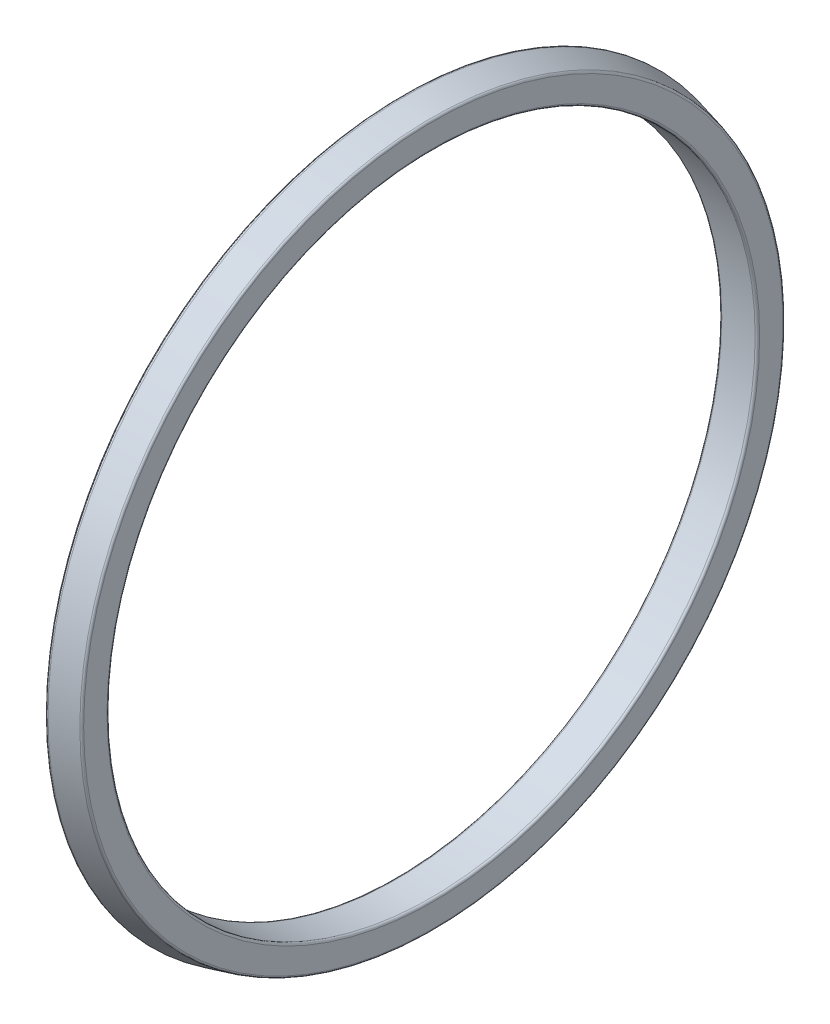
ISO-10303-21;
HEADER;
FILE_DESCRIPTION(('STEP AP214'),'2;1');
FILE_NAME('part.step','',(''),(''),'','','');
FILE_SCHEMA(('AUTOMOTIVE_DESIGN { 1 0 10303 214 1 1 1 1 }'));
ENDSEC;
DATA;
#1=APPLICATION_CONTEXT('core data for automotive mechanical design processes');
#2=APPLICATION_PROTOCOL_DEFINITION('international standard','automotive_design',2000,#1);
#3=PRODUCT_CONTEXT('',#1,'mechanical');
#4=PRODUCT('Part','Part','',(#3));
#5=PRODUCT_RELATED_PRODUCT_CATEGORY('part','',(#4));
#6=PRODUCT_DEFINITION_FORMATION('','',#4);
#7=PRODUCT_DEFINITION_CONTEXT('part definition',#1,'design');
#8=PRODUCT_DEFINITION('design','',#6,#7);
#9=PRODUCT_DEFINITION_SHAPE('','',#8);
#10=(LENGTH_UNIT() NAMED_UNIT(*) SI_UNIT(.MILLI.,.METRE.));
#11=(NAMED_UNIT(*) PLANE_ANGLE_UNIT() SI_UNIT($,.RADIAN.));
#12=(NAMED_UNIT(*) SI_UNIT($,.STERADIAN.) SOLID_ANGLE_UNIT());
#13=UNCERTAINTY_MEASURE_WITH_UNIT(LENGTH_MEASURE(1.E-05),#10,'distance_accuracy_value','');
#14=(GEOMETRIC_REPRESENTATION_CONTEXT(3) GLOBAL_UNCERTAINTY_ASSIGNED_CONTEXT((#13)) GLOBAL_UNIT_ASSIGNED_CONTEXT((#10,
#11,#12)) REPRESENTATION_CONTEXT('',''));
#15=CARTESIAN_POINT('',(0.,0.,0.));
#16=DIRECTION('',(0.,0.,1.));
#17=DIRECTION('',(1.,0.,0.));
#18=AXIS2_PLACEMENT_3D('',#15,#16,#17);
#19=CARTESIAN_POINT('',(2.03338319299465,0.,0.));
#20=DIRECTION('',(-1.,0.,0.));
#21=DIRECTION('',(0.,0.,1.));
#22=AXIS2_PLACEMENT_3D('',#19,#20,#21);
#23=TOROIDAL_SURFACE('',#22,14.5238319449305,0.0999999999999996);
#24=CARTESIAN_POINT('',(2.13338319299465,0.,0.));
#25=DIRECTION('',(-1.,0.,0.));
#26=DIRECTION('',(0.,0.,1.));
#27=AXIS2_PLACEMENT_3D('',#24,#25,#26);
#28=CIRCLE('',#27,14.5238319449305);
#29=CARTESIAN_POINT('',(2.13338319299465,0.,14.5238319449305));
#30=VERTEX_POINT('',#29);
#31=EDGE_CURVE('E81',#30,#30,#28,.T.);
#32=ORIENTED_EDGE('',*,*,#31,.F.);
#33=EDGE_LOOP('',(#32));
#34=FACE_BOUND('',#33,.T.);
#35=CARTESIAN_POINT('',(2.03338319299465,0.,0.));
#36=DIRECTION('',(-1.,0.,0.));
#37=DIRECTION('',(0.,0.,1.));
#38=AXIS2_PLACEMENT_3D('',#35,#36,#37);
#39=CIRCLE('',#38,14.4238319449305);
#40=CARTESIAN_POINT('',(2.03338319299465,0.,14.4238319449305));
#41=VERTEX_POINT('',#40);
#42=EDGE_CURVE('E10',#41,#41,#39,.T.);
#43=ORIENTED_EDGE('',*,*,#42,.T.);
#44=EDGE_LOOP('',(#43));
#45=FACE_BOUND('',#44,.T.);
#46=ADVANCED_FACE('F35',(#34,#45),#23,.T.);
#47=CARTESIAN_POINT('',(0.,0.,0.));
#48=DIRECTION('',(-1.,0.,0.));
#49=DIRECTION('',(0.,0.,1.));
#50=AXIS2_PLACEMENT_3D('',#47,#48,#49);
#51=CYLINDRICAL_SURFACE('',#50,14.4238319449305);
#52=ORIENTED_EDGE('',*,*,#42,.F.);
#53=EDGE_LOOP('',(#52));
#54=FACE_BOUND('',#53,.T.);
#55=CARTESIAN_POINT('',(0.551015329733392,0.,0.));
#56=DIRECTION('',(-1.,0.,0.));
#57=DIRECTION('',(0.,0.,1.));
#58=AXIS2_PLACEMENT_3D('',#55,#56,#57);
#59=CIRCLE('',#58,14.4238319449305);
#60=CARTESIAN_POINT('',(0.551015329733392,0.,14.4238319449305));
#61=VERTEX_POINT('',#60);
#62=EDGE_CURVE('E41',#61,#61,#59,.T.);
#63=ORIENTED_EDGE('',*,*,#62,.T.);
#64=EDGE_LOOP('',(#63));
#65=FACE_BOUND('',#64,.T.);
#66=ADVANCED_FACE('F88',(#54,#65),#51,.F.);
#67=CARTESIAN_POINT('',(0.551015329733392,0.,0.));
#68=DIRECTION('',(-1.,0.,0.));
#69=DIRECTION('',(0.,0.,1.));
#70=AXIS2_PLACEMENT_3D('',#67,#68,#69);
#71=TOROIDAL_SURFACE('',#70,14.5238319449305,0.0999999999999997);
#72=ORIENTED_EDGE('',*,*,#62,.F.);
#73=EDGE_LOOP('',(#72));
#74=FACE_BOUND('',#73,.T.);
#75=CARTESIAN_POINT('',(0.451015329733392,0.,0.));
#76=DIRECTION('',(-1.,0.,0.));
#77=DIRECTION('',(0.,0.,1.));
#78=AXIS2_PLACEMENT_3D('',#75,#76,#77);
#79=CIRCLE('',#78,14.5238319449305);
#80=CARTESIAN_POINT('',(0.451015329733392,0.,14.5238319449305));
#81=VERTEX_POINT('',#80);
#82=EDGE_CURVE('E45',#81,#81,#79,.T.);
#83=ORIENTED_EDGE('',*,*,#82,.T.);
#84=EDGE_LOOP('',(#83));
#85=FACE_BOUND('',#84,.T.);
#86=ADVANCED_FACE('F92',(#74,#85),#71,.T.);
#87=CARTESIAN_POINT('',(0.451015329733391,0.,-14.9442338573862));
#88=DIRECTION('',(1.,0.,0.));
#89=DIRECTION('',(0.,0.,-1.));
#90=AXIS2_PLACEMENT_3D('',#87,#88,#89);
#91=PLANE('',#90);
#92=ORIENTED_EDGE('',*,*,#82,.F.);
#93=EDGE_LOOP('',(#92));
#94=FACE_BOUND('',#93,.T.);
#95=CARTESIAN_POINT('',(0.451015329733391,0.,0.));
#96=DIRECTION('',(-1.,0.,0.));
#97=DIRECTION('',(0.,0.,1.));
#98=AXIS2_PLACEMENT_3D('',#95,#96,#97);
#99=CIRCLE('',#98,14.9442338573862);
#100=CARTESIAN_POINT('',(0.451015329733391,0.,14.9442338573862));
#101=VERTEX_POINT('',#100);
#102=EDGE_CURVE('E49',#101,#101,#99,.T.);
#103=ORIENTED_EDGE('',*,*,#102,.T.);
#104=EDGE_LOOP('',(#103));
#105=FACE_BOUND('',#104,.T.);
#106=ADVANCED_FACE('F97',(#94,#105),#91,.F.);
#107=CARTESIAN_POINT('',(0.551015329733392,0.,0.));
#108=DIRECTION('',(-1.,0.,0.));
#109=DIRECTION('',(0.,0.,1.));
#110=AXIS2_PLACEMENT_3D('',#107,#108,#109);
#111=TOROIDAL_SURFACE('',#110,14.9442338573862,0.100000000000001);
#112=ORIENTED_EDGE('',*,*,#102,.F.);
#113=EDGE_LOOP('',(#112));
#114=FACE_BOUND('',#113,.T.);
#115=CARTESIAN_POINT('',(0.540504980881254,0.,0.));
#116=DIRECTION('',(-1.,0.,0.));
#117=DIRECTION('',(0.,0.,1.));
#118=AXIS2_PLACEMENT_3D('',#115,#116,#117);
#119=CIRCLE('',#118,15.0436799863556);
#120=CARTESIAN_POINT('',(0.540504980881254,0.,15.0436799863556));
#121=VERTEX_POINT('',#120);
#122=EDGE_CURVE('E54',#121,#121,#119,.T.);
#123=ORIENTED_EDGE('',*,*,#122,.T.);
#124=EDGE_LOOP('',(#123));
#125=FACE_BOUND('',#124,.T.);
#126=ADVANCED_FACE('F103',(#114,#125),#111,.T.);
#127=CARTESIAN_POINT('',(1.33167649269447,0.,0.));
#128=DIRECTION('',(1.,0.,0.));
#129=DIRECTION('',(0.,0.,-1.));
#130=AXIS2_PLACEMENT_3D('',#127,#128,#129);
#131=CONICAL_SURFACE('',#130,15.1272980082656,0.105297965375057);
#132=ORIENTED_EDGE('',*,*,#122,.F.);
#133=EDGE_LOOP('',(#132));
#134=FACE_BOUND('',#133,.T.);
#135=CARTESIAN_POINT('',(1.33167649269447,0.,0.));
#136=DIRECTION('',(-1.,0.,0.));
#137=DIRECTION('',(0.,0.,1.));
#138=AXIS2_PLACEMENT_3D('',#135,#136,#137);
#139=CIRCLE('',#138,15.1272980082656);
#140=CARTESIAN_POINT('',(1.33167649269447,0.,15.1272980082656));
#141=VERTEX_POINT('',#140);
#142=EDGE_CURVE('E57',#141,#141,#139,.T.);
#143=ORIENTED_EDGE('',*,*,#142,.T.);
#144=EDGE_LOOP('',(#143));
#145=FACE_BOUND('',#144,.T.);
#146=ADVANCED_FACE('F107',(#134,#145),#131,.T.);
#147=CARTESIAN_POINT('',(1.32116614384233,0.,0.));
#148=DIRECTION('',(-1.,0.,0.));
#149=DIRECTION('',(0.,0.,1.));
#150=AXIS2_PLACEMENT_3D('',#147,#148,#149);
#151=TOROIDAL_SURFACE('',#150,15.226744137235,0.1);
#152=ORIENTED_EDGE('',*,*,#142,.F.);
#153=EDGE_LOOP('',(#152));
#154=FACE_BOUND('',#153,.T.);
#155=CARTESIAN_POINT('',(1.36905135691039,0.,0.));
#156=DIRECTION('',(-1.,0.,0.));
#157=DIRECTION('',(0.,0.,1.));
#158=AXIS2_PLACEMENT_3D('',#155,#156,#157);
#159=CIRCLE('',#158,15.3145336945265);
#160=CARTESIAN_POINT('',(1.36905135691039,0.,15.3145336945265));
#161=VERTEX_POINT('',#160);
#162=EDGE_CURVE('E60',#161,#161,#159,.T.);
#163=ORIENTED_EDGE('',*,*,#162,.T.);
#164=EDGE_LOOP('',(#163));
#165=FACE_BOUND('',#164,.T.);
#166=ADVANCED_FACE('F111',(#154,#165),#151,.F.);
#167=CARTESIAN_POINT('',(0.750790376259869,0.,0.));
#168=DIRECTION('',(-1.,0.,0.));
#169=DIRECTION('',(0.,0.,1.));
#170=AXIS2_PLACEMENT_3D('',#167,#168,#169);
#171=CONICAL_SURFACE('',#170,15.6517669566995,0.499346721680129);
#172=ORIENTED_EDGE('',*,*,#162,.F.);
#173=EDGE_LOOP('',(#172));
#174=FACE_BOUND('',#173,.T.);
#175=CARTESIAN_POINT('',(0.750790376259869,0.,0.));
#176=DIRECTION('',(-1.,0.,0.));
#177=DIRECTION('',(0.,0.,1.));
#178=AXIS2_PLACEMENT_3D('',#175,#176,#177);
#179=CIRCLE('',#178,15.6517669566995);
#180=CARTESIAN_POINT('',(0.750790376259869,0.,15.6517669566995));
#181=VERTEX_POINT('',#180);
#182=EDGE_CURVE('E63',#181,#181,#179,.T.);
#183=ORIENTED_EDGE('',*,*,#182,.T.);
#184=EDGE_LOOP('',(#183));
#185=FACE_BOUND('',#184,.T.);
#186=ADVANCED_FACE('F115',(#174,#185),#171,.F.);
#187=CARTESIAN_POINT('',(0.798675589327925,0.,0.));
#188=DIRECTION('',(-1.,0.,0.));
#189=DIRECTION('',(0.,0.,1.));
#190=AXIS2_PLACEMENT_3D('',#187,#188,#189);
#191=TOROIDAL_SURFACE('',#190,15.7395565139909,0.100000000000001);
#192=ORIENTED_EDGE('',*,*,#182,.F.);
#193=EDGE_LOOP('',(#192));
#194=FACE_BOUND('',#193,.T.);
#195=CARTESIAN_POINT('',(0.726301834831262,0.,0.));
#196=DIRECTION('',(-1.,0.,0.));
#197=DIRECTION('',(0.,0.,1.));
#198=AXIS2_PLACEMENT_3D('',#195,#196,#197);
#199=CIRCLE('',#198,15.8085640473482);
#200=CARTESIAN_POINT('',(0.726301834831262,0.,15.8085640473482));
#201=VERTEX_POINT('',#200);
#202=EDGE_CURVE('E66',#201,#201,#199,.T.);
#203=ORIENTED_EDGE('',*,*,#202,.T.);
#204=EDGE_LOOP('',(#203));
#205=FACE_BOUND('',#204,.T.);
#206=ADVANCED_FACE('F119',(#194,#205),#191,.T.);
#207=CARTESIAN_POINT('',(0.832127203197463,0.,0.));
#208=DIRECTION('',(1.,0.,0.));
#209=DIRECTION('',(0.,0.,-1.));
#210=AXIS2_PLACEMENT_3D('',#207,#208,#209);
#211=CONICAL_SURFACE('',#210,15.9195516288054,0.809203189582519);
#212=ORIENTED_EDGE('',*,*,#202,.F.);
#213=EDGE_LOOP('',(#212));
#214=FACE_BOUND('',#213,.T.);
#215=CARTESIAN_POINT('',(0.832127203197463,0.,0.));
#216=DIRECTION('',(-1.,0.,0.));
#217=DIRECTION('',(0.,0.,1.));
#218=AXIS2_PLACEMENT_3D('',#215,#216,#217);
#219=CIRCLE('',#218,15.9195516288054);
#220=CARTESIAN_POINT('',(0.832127203197463,0.,15.9195516288054));
#221=VERTEX_POINT('',#220);
#222=EDGE_CURVE('E69',#221,#221,#219,.T.);
#223=ORIENTED_EDGE('',*,*,#222,.T.);
#224=EDGE_LOOP('',(#223));
#225=FACE_BOUND('',#224,.T.);
#226=ADVANCED_FACE('F123',(#214,#225),#211,.T.);
#227=CARTESIAN_POINT('',(0.904500957694127,0.,0.));
#228=DIRECTION('',(-1.,0.,0.));
#229=DIRECTION('',(0.,0.,1.));
#230=AXIS2_PLACEMENT_3D('',#227,#228,#229);
#231=TOROIDAL_SURFACE('',#230,15.8505440954482,0.1);
#232=ORIENTED_EDGE('',*,*,#222,.F.);
#233=EDGE_LOOP('',(#232));
#234=FACE_BOUND('',#233,.T.);
#235=CARTESIAN_POINT('',(0.929385167226529,0.,0.));
#236=DIRECTION('',(-1.,0.,0.));
#237=DIRECTION('',(0.,0.,1.));
#238=AXIS2_PLACEMENT_3D('',#235,#236,#237);
#239=CIRCLE('',#238,15.9473985022449);
#240=CARTESIAN_POINT('',(0.929385167226529,0.,15.9473985022449));
#241=VERTEX_POINT('',#240);
#242=EDGE_CURVE('E72',#241,#241,#239,.T.);
#243=ORIENTED_EDGE('',*,*,#242,.T.);
#244=EDGE_LOOP('',(#243));
#245=FACE_BOUND('',#244,.T.);
#246=ADVANCED_FACE('F127',(#234,#245),#231,.T.);
#247=CARTESIAN_POINT('',(2.05826740252705,0.,0.));
#248=DIRECTION('',(-1.,0.,0.));
#249=DIRECTION('',(0.,0.,1.));
#250=AXIS2_PLACEMENT_3D('',#247,#248,#249);
#251=CONICAL_SURFACE('',#250,15.657361703614,0.251484560621642);
#252=ORIENTED_EDGE('',*,*,#242,.F.);
#253=EDGE_LOOP('',(#252));
#254=FACE_BOUND('',#253,.T.);
#255=CARTESIAN_POINT('',(2.05826740252705,0.,0.));
#256=DIRECTION('',(-1.,0.,0.));
#257=DIRECTION('',(0.,0.,1.));
#258=AXIS2_PLACEMENT_3D('',#255,#256,#257);
#259=CIRCLE('',#258,15.657361703614);
#260=CARTESIAN_POINT('',(2.05826740252705,0.,15.657361703614));
#261=VERTEX_POINT('',#260);
#262=EDGE_CURVE('E75',#261,#261,#259,.T.);
#263=ORIENTED_EDGE('',*,*,#262,.T.);
#264=EDGE_LOOP('',(#263));
#265=FACE_BOUND('',#264,.T.);
#266=ADVANCED_FACE('F131',(#254,#265),#251,.T.);
#267=CARTESIAN_POINT('',(2.03338319299465,0.,0.));
#268=DIRECTION('',(-1.,0.,0.));
#269=DIRECTION('',(0.,0.,1.));
#270=AXIS2_PLACEMENT_3D('',#267,#268,#269);
#271=TOROIDAL_SURFACE('',#270,15.5605072968172,0.0999999999999998);
#272=ORIENTED_EDGE('',*,*,#262,.F.);
#273=EDGE_LOOP('',(#272));
#274=FACE_BOUND('',#273,.T.);
#275=CARTESIAN_POINT('',(2.13338319299465,0.,0.));
#276=DIRECTION('',(-1.,0.,0.));
#277=DIRECTION('',(0.,0.,1.));
#278=AXIS2_PLACEMENT_3D('',#275,#276,#277);
#279=CIRCLE('',#278,15.5605072968172);
#280=CARTESIAN_POINT('',(2.13338319299465,0.,15.5605072968172));
#281=VERTEX_POINT('',#280);
#282=EDGE_CURVE('E78',#281,#281,#279,.T.);
#283=ORIENTED_EDGE('',*,*,#282,.T.);
#284=EDGE_LOOP('',(#283));
#285=FACE_BOUND('',#284,.T.);
#286=ADVANCED_FACE('F135',(#274,#285),#271,.T.);
#287=CARTESIAN_POINT('',(2.13338319299465,0.,-14.5238319449305));
#288=DIRECTION('',(-1.,0.,0.));
#289=DIRECTION('',(0.,0.,1.));
#290=AXIS2_PLACEMENT_3D('',#287,#288,#289);
#291=PLANE('',#290);
#292=ORIENTED_EDGE('',*,*,#282,.F.);
#293=EDGE_LOOP('',(#292));
#294=FACE_BOUND('',#293,.T.);
#295=ORIENTED_EDGE('',*,*,#31,.T.);
#296=EDGE_LOOP('',(#295));
#297=FACE_BOUND('',#296,.T.);
#298=ADVANCED_FACE('F85',(#294,#297),#291,.F.);
#299=CLOSED_SHELL('',(#46,#66,#86,#106,#126,#146,#166,#186,#206,#226,#246,#266,#286,#298));
#300=MANIFOLD_SOLID_BREP('B2',#299);
#301=ADVANCED_BREP_SHAPE_REPRESENTATION('',(#18,#300),#14);
#302=SHAPE_DEFINITION_REPRESENTATION(#9,#301);
ENDSEC;
END-ISO-10303-21;
